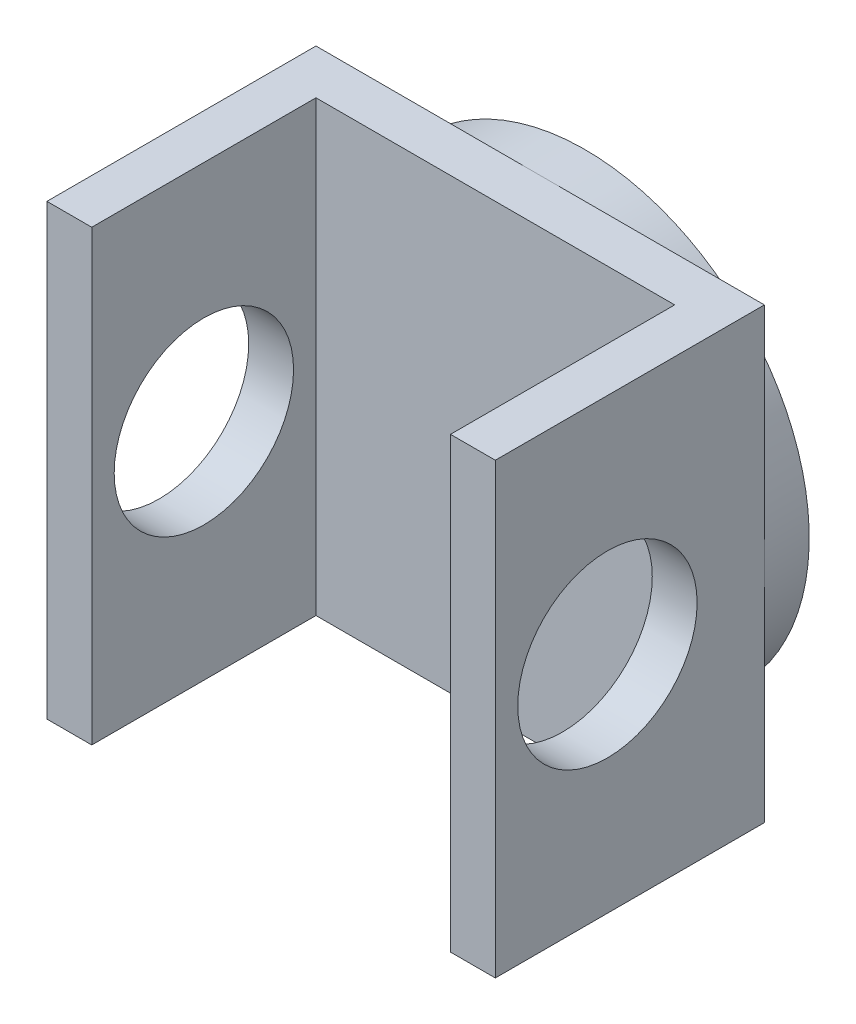
ISO-10303-21;
HEADER;
FILE_DESCRIPTION(('STEP AP214'),'2;1');
FILE_NAME('part.step','',(''),(''),'','','');
FILE_SCHEMA(('AUTOMOTIVE_DESIGN { 1 0 10303 214 1 1 1 1 }'));
ENDSEC;
DATA;
#1=APPLICATION_CONTEXT('core data for automotive mechanical design processes');
#2=APPLICATION_PROTOCOL_DEFINITION('international standard','automotive_design',2000,#1);
#3=PRODUCT_CONTEXT('',#1,'mechanical');
#4=PRODUCT('Part','Part','',(#3));
#5=PRODUCT_RELATED_PRODUCT_CATEGORY('part','',(#4));
#6=PRODUCT_DEFINITION_FORMATION('','',#4);
#7=PRODUCT_DEFINITION_CONTEXT('part definition',#1,'design');
#8=PRODUCT_DEFINITION('design','',#6,#7);
#9=PRODUCT_DEFINITION_SHAPE('','',#8);
#10=(LENGTH_UNIT() NAMED_UNIT(*) SI_UNIT(.MILLI.,.METRE.));
#11=(NAMED_UNIT(*) PLANE_ANGLE_UNIT() SI_UNIT($,.RADIAN.));
#12=(NAMED_UNIT(*) SI_UNIT($,.STERADIAN.) SOLID_ANGLE_UNIT());
#13=UNCERTAINTY_MEASURE_WITH_UNIT(LENGTH_MEASURE(1.E-05),#10,'distance_accuracy_value','');
#14=(GEOMETRIC_REPRESENTATION_CONTEXT(3) GLOBAL_UNCERTAINTY_ASSIGNED_CONTEXT((#13)) GLOBAL_UNIT_ASSIGNED_CONTEXT((#10,
#11,#12)) REPRESENTATION_CONTEXT('',''));
#15=CARTESIAN_POINT('',(0.,0.,0.));
#16=DIRECTION('',(0.,0.,1.));
#17=DIRECTION('',(1.,0.,0.));
#18=AXIS2_PLACEMENT_3D('',#15,#16,#17);
#19=CARTESIAN_POINT('',(0.,0.,0.));
#20=DIRECTION('',(0.,0.,1.));
#21=DIRECTION('',(1.,0.,0.));
#22=AXIS2_PLACEMENT_3D('',#19,#20,#21);
#23=PLANE('',#22);
#24=CARTESIAN_POINT('',(0.,0.,0.));
#25=DIRECTION('',(0.,0.,-1.));
#26=DIRECTION('',(-1.,0.,0.));
#27=AXIS2_PLACEMENT_3D('',#24,#25,#26);
#28=CIRCLE('',#27,5.);
#29=CARTESIAN_POINT('',(-5.,0.,0.));
#30=VERTEX_POINT('',#29);
#31=CARTESIAN_POINT('',(0.,5.,0.));
#32=VERTEX_POINT('',#31);
#33=EDGE_CURVE('E43',#30,#32,#28,.T.);
#34=ORIENTED_EDGE('',*,*,#33,.F.);
#35=DIRECTION('',(0.,-1.,0.));
#36=VECTOR('',#35,1.);
#37=CARTESIAN_POINT('',(-5.,-5.,0.));
#38=LINE('',#37,#36);
#39=CARTESIAN_POINT('',(-5.,5.,0.));
#40=VERTEX_POINT('',#39);
#41=EDGE_CURVE('E114',#40,#30,#38,.T.);
#42=ORIENTED_EDGE('',*,*,#41,.F.);
#43=DIRECTION('',(-1.,0.,0.));
#44=VECTOR('',#43,1.);
#45=CARTESIAN_POINT('',(5.,5.,0.));
#46=LINE('',#45,#44);
#47=EDGE_CURVE('E129',#32,#40,#46,.T.);
#48=ORIENTED_EDGE('',*,*,#47,.F.);
#49=EDGE_LOOP('',(#34,#42,#48));
#50=FACE_BOUND('',#49,.T.);
#51=ADVANCED_FACE('F32',(#50),#23,.F.);
#52=CARTESIAN_POINT('',(5.,0.,0.));
#53=VERTEX_POINT('',#52);
#54=EDGE_CURVE('E11',#32,#53,#28,.T.);
#55=ORIENTED_EDGE('',*,*,#54,.F.);
#56=CARTESIAN_POINT('',(5.,5.,0.));
#57=VERTEX_POINT('',#56);
#58=EDGE_CURVE('E190',#57,#32,#46,.T.);
#59=ORIENTED_EDGE('',*,*,#58,.F.);
#60=DIRECTION('',(0.,1.,0.));
#61=VECTOR('',#60,1.);
#62=CARTESIAN_POINT('',(5.,-5.,0.));
#63=LINE('',#62,#61);
#64=EDGE_CURVE('E193',#53,#57,#63,.T.);
#65=ORIENTED_EDGE('',*,*,#64,.F.);
#66=EDGE_LOOP('',(#55,#59,#65));
#67=FACE_BOUND('',#66,.T.);
#68=ADVANCED_FACE('F221',(#67),#23,.F.);
#69=CARTESIAN_POINT('',(0.,-5.,0.));
#70=VERTEX_POINT('',#69);
#71=EDGE_CURVE('E41',#53,#70,#28,.T.);
#72=ORIENTED_EDGE('',*,*,#71,.F.);
#73=CARTESIAN_POINT('',(5.,-5.,0.));
#74=VERTEX_POINT('',#73);
#75=EDGE_CURVE('E194',#74,#53,#63,.T.);
#76=ORIENTED_EDGE('',*,*,#75,.F.);
#77=DIRECTION('',(1.,0.,0.));
#78=VECTOR('',#77,1.);
#79=CARTESIAN_POINT('',(5.,-5.,0.));
#80=LINE('',#79,#78);
#81=EDGE_CURVE('E121',#70,#74,#80,.T.);
#82=ORIENTED_EDGE('',*,*,#81,.F.);
#83=EDGE_LOOP('',(#72,#76,#82));
#84=FACE_BOUND('',#83,.T.);
#85=ADVANCED_FACE('F207',(#84),#23,.F.);
#86=CARTESIAN_POINT('',(0.,0.,1.));
#87=DIRECTION('',(0.,0.,1.));
#88=DIRECTION('',(1.,0.,0.));
#89=AXIS2_PLACEMENT_3D('',#86,#87,#88);
#90=PLANE('',#89);
#91=DIRECTION('',(1.,0.,0.));
#92=VECTOR('',#91,1.);
#93=CARTESIAN_POINT('',(5.,-5.,1.));
#94=LINE('',#93,#92);
#95=CARTESIAN_POINT('',(-4.,-5.,1.));
#96=VERTEX_POINT('',#95);
#97=CARTESIAN_POINT('',(4.,-5.,1.));
#98=VERTEX_POINT('',#97);
#99=EDGE_CURVE('E187',#96,#98,#94,.T.);
#100=ORIENTED_EDGE('',*,*,#99,.T.);
#101=DIRECTION('',(0.,-1.,0.));
#102=VECTOR('',#101,1.);
#103=CARTESIAN_POINT('',(4.,-5.,1.));
#104=LINE('',#103,#102);
#105=CARTESIAN_POINT('',(4.,5.,1.));
#106=VERTEX_POINT('',#105);
#107=EDGE_CURVE('E149',#106,#98,#104,.T.);
#108=ORIENTED_EDGE('',*,*,#107,.F.);
#109=DIRECTION('',(-1.,0.,0.));
#110=VECTOR('',#109,1.);
#111=CARTESIAN_POINT('',(5.,5.,1.));
#112=LINE('',#111,#110);
#113=CARTESIAN_POINT('',(-4.,5.,1.));
#114=VERTEX_POINT('',#113);
#115=EDGE_CURVE('E189',#106,#114,#112,.T.);
#116=ORIENTED_EDGE('',*,*,#115,.T.);
#117=DIRECTION('',(0.,1.,0.));
#118=VECTOR('',#117,1.);
#119=CARTESIAN_POINT('',(-4.,-5.,1.));
#120=LINE('',#119,#118);
#121=EDGE_CURVE('E169',#96,#114,#120,.T.);
#122=ORIENTED_EDGE('',*,*,#121,.F.);
#123=EDGE_LOOP('',(#100,#108,#116,#122));
#124=FACE_BOUND('',#123,.T.);
#125=ADVANCED_FACE('F234',(#124),#90,.T.);
#126=CARTESIAN_POINT('',(-5.,-5.,1.));
#127=DIRECTION('',(1.,0.,0.));
#128=DIRECTION('',(0.,0.,-1.));
#129=AXIS2_PLACEMENT_3D('',#126,#127,#128);
#130=PLANE('',#129);
#131=CARTESIAN_POINT('',(-5.,0.,3.5));
#132=DIRECTION('',(1.,0.,0.));
#133=DIRECTION('',(0.,0.,-1.));
#134=AXIS2_PLACEMENT_3D('',#131,#132,#133);
#135=CIRCLE('',#134,2.);
#136=CARTESIAN_POINT('',(-5.,0.,1.5));
#137=VERTEX_POINT('',#136);
#138=EDGE_CURVE('E146',#137,#137,#135,.T.);
#139=ORIENTED_EDGE('',*,*,#138,.T.);
#140=EDGE_LOOP('',(#139));
#141=FACE_BOUND('',#140,.T.);
#142=ORIENTED_EDGE('',*,*,#41,.T.);
#143=CARTESIAN_POINT('',(-5.,-5.,0.));
#144=VERTEX_POINT('',#143);
#145=EDGE_CURVE('E115',#30,#144,#38,.T.);
#146=ORIENTED_EDGE('',*,*,#145,.T.);
#147=DIRECTION('',(0.,0.,-1.));
#148=VECTOR('',#147,1.);
#149=CARTESIAN_POINT('',(-5.,-5.,1.));
#150=LINE('',#149,#148);
#151=CARTESIAN_POINT('',(-5.,-5.,6.));
#152=VERTEX_POINT('',#151);
#153=EDGE_CURVE('E135',#152,#144,#150,.T.);
#154=ORIENTED_EDGE('',*,*,#153,.F.);
#155=DIRECTION('',(0.,-1.,0.));
#156=VECTOR('',#155,1.);
#157=CARTESIAN_POINT('',(-5.,-5.,6.));
#158=LINE('',#157,#156);
#159=CARTESIAN_POINT('',(-5.,5.,6.));
#160=VERTEX_POINT('',#159);
#161=EDGE_CURVE('E170',#160,#152,#158,.T.);
#162=ORIENTED_EDGE('',*,*,#161,.F.);
#163=DIRECTION('',(0.,0.,-1.));
#164=VECTOR('',#163,1.);
#165=CARTESIAN_POINT('',(-5.,5.,1.));
#166=LINE('',#165,#164);
#167=EDGE_CURVE('E117',#160,#40,#166,.T.);
#168=ORIENTED_EDGE('',*,*,#167,.T.);
#169=EDGE_LOOP('',(#142,#146,#154,#162,#168));
#170=FACE_BOUND('',#169,.T.);
#171=ADVANCED_FACE('F34',(#141,#170),#130,.F.);
#172=CARTESIAN_POINT('',(5.,-5.,1.));
#173=DIRECTION('',(0.,1.,0.));
#174=DIRECTION('',(-1.,0.,0.));
#175=AXIS2_PLACEMENT_3D('',#172,#173,#174);
#176=PLANE('',#175);
#177=EDGE_CURVE('E125',#144,#70,#80,.T.);
#178=ORIENTED_EDGE('',*,*,#177,.T.);
#179=ORIENTED_EDGE('',*,*,#81,.T.);
#180=DIRECTION('',(0.,0.,-1.));
#181=VECTOR('',#180,1.);
#182=CARTESIAN_POINT('',(5.,-5.,1.));
#183=LINE('',#182,#181);
#184=CARTESIAN_POINT('',(5.,-5.,6.));
#185=VERTEX_POINT('',#184);
#186=EDGE_CURVE('E136',#185,#74,#183,.T.);
#187=ORIENTED_EDGE('',*,*,#186,.F.);
#188=DIRECTION('',(1.,0.,0.));
#189=VECTOR('',#188,1.);
#190=CARTESIAN_POINT('',(4.,-5.,6.));
#191=LINE('',#190,#189);
#192=CARTESIAN_POINT('',(4.,-5.,6.));
#193=VERTEX_POINT('',#192);
#194=EDGE_CURVE('E153',#193,#185,#191,.T.);
#195=ORIENTED_EDGE('',*,*,#194,.F.);
#196=DIRECTION('',(0.,0.,-1.));
#197=VECTOR('',#196,1.);
#198=CARTESIAN_POINT('',(4.,-5.,6.));
#199=LINE('',#198,#197);
#200=EDGE_CURVE('E166',#193,#98,#199,.T.);
#201=ORIENTED_EDGE('',*,*,#200,.T.);
#202=ORIENTED_EDGE('',*,*,#99,.F.);
#203=DIRECTION('',(0.,0.,-1.));
#204=VECTOR('',#203,1.);
#205=CARTESIAN_POINT('',(-4.,-5.,6.));
#206=LINE('',#205,#204);
#207=CARTESIAN_POINT('',(-4.,-5.,6.));
#208=VERTEX_POINT('',#207);
#209=EDGE_CURVE('E127',#208,#96,#206,.T.);
#210=ORIENTED_EDGE('',*,*,#209,.F.);
#211=DIRECTION('',(1.,0.,0.));
#212=VECTOR('',#211,1.);
#213=CARTESIAN_POINT('',(-4.,-5.,6.));
#214=LINE('',#213,#212);
#215=EDGE_CURVE('E173',#152,#208,#214,.T.);
#216=ORIENTED_EDGE('',*,*,#215,.F.);
#217=ORIENTED_EDGE('',*,*,#153,.T.);
#218=EDGE_LOOP('',(#178,#179,#187,#195,#201,#202,#210,#216,#217));
#219=FACE_BOUND('',#218,.T.);
#220=ADVANCED_FACE('F208',(#219),#176,.F.);
#221=CARTESIAN_POINT('',(5.,-5.,1.));
#222=DIRECTION('',(-1.,0.,0.));
#223=DIRECTION('',(0.,0.,1.));
#224=AXIS2_PLACEMENT_3D('',#221,#222,#223);
#225=PLANE('',#224);
#226=CARTESIAN_POINT('',(5.,0.,3.5));
#227=DIRECTION('',(1.,0.,0.));
#228=DIRECTION('',(0.,0.,-1.));
#229=AXIS2_PLACEMENT_3D('',#226,#227,#228);
#230=CIRCLE('',#229,2.);
#231=CARTESIAN_POINT('',(5.,0.,1.5));
#232=VERTEX_POINT('',#231);
#233=EDGE_CURVE('E140',#232,#232,#230,.T.);
#234=ORIENTED_EDGE('',*,*,#233,.F.);
#235=EDGE_LOOP('',(#234));
#236=FACE_BOUND('',#235,.T.);
#237=ORIENTED_EDGE('',*,*,#75,.T.);
#238=ORIENTED_EDGE('',*,*,#64,.T.);
#239=DIRECTION('',(0.,0.,-1.));
#240=VECTOR('',#239,1.);
#241=CARTESIAN_POINT('',(5.,5.,1.));
#242=LINE('',#241,#240);
#243=CARTESIAN_POINT('',(5.,5.,6.));
#244=VERTEX_POINT('',#243);
#245=EDGE_CURVE('E199',#244,#57,#242,.T.);
#246=ORIENTED_EDGE('',*,*,#245,.F.);
#247=DIRECTION('',(0.,1.,0.));
#248=VECTOR('',#247,1.);
#249=CARTESIAN_POINT('',(5.,-5.,6.));
#250=LINE('',#249,#248);
#251=EDGE_CURVE('E156',#185,#244,#250,.T.);
#252=ORIENTED_EDGE('',*,*,#251,.F.);
#253=ORIENTED_EDGE('',*,*,#186,.T.);
#254=EDGE_LOOP('',(#237,#238,#246,#252,#253));
#255=FACE_BOUND('',#254,.T.);
#256=ADVANCED_FACE('F205',(#236,#255),#225,.F.);
#257=CARTESIAN_POINT('',(5.,5.,1.));
#258=DIRECTION('',(0.,-1.,0.));
#259=DIRECTION('',(1.,0.,0.));
#260=AXIS2_PLACEMENT_3D('',#257,#258,#259);
#261=PLANE('',#260);
#262=ORIENTED_EDGE('',*,*,#58,.T.);
#263=ORIENTED_EDGE('',*,*,#47,.T.);
#264=ORIENTED_EDGE('',*,*,#167,.F.);
#265=DIRECTION('',(-1.,0.,0.));
#266=VECTOR('',#265,1.);
#267=CARTESIAN_POINT('',(-4.,5.,6.));
#268=LINE('',#267,#266);
#269=CARTESIAN_POINT('',(-4.,5.,6.));
#270=VERTEX_POINT('',#269);
#271=EDGE_CURVE('E177',#270,#160,#268,.T.);
#272=ORIENTED_EDGE('',*,*,#271,.F.);
#273=DIRECTION('',(0.,0.,-1.));
#274=VECTOR('',#273,1.);
#275=CARTESIAN_POINT('',(-4.,5.,6.));
#276=LINE('',#275,#274);
#277=EDGE_CURVE('E180',#270,#114,#276,.T.);
#278=ORIENTED_EDGE('',*,*,#277,.T.);
#279=ORIENTED_EDGE('',*,*,#115,.F.);
#280=DIRECTION('',(0.,0.,-1.));
#281=VECTOR('',#280,1.);
#282=CARTESIAN_POINT('',(4.,5.,6.));
#283=LINE('',#282,#281);
#284=CARTESIAN_POINT('',(4.,5.,6.));
#285=VERTEX_POINT('',#284);
#286=EDGE_CURVE('E161',#285,#106,#283,.T.);
#287=ORIENTED_EDGE('',*,*,#286,.F.);
#288=DIRECTION('',(-1.,0.,0.));
#289=VECTOR('',#288,1.);
#290=CARTESIAN_POINT('',(4.,5.,6.));
#291=LINE('',#290,#289);
#292=EDGE_CURVE('E159',#244,#285,#291,.T.);
#293=ORIENTED_EDGE('',*,*,#292,.F.);
#294=ORIENTED_EDGE('',*,*,#245,.T.);
#295=EDGE_LOOP('',(#262,#263,#264,#272,#278,#279,#287,#293,#294));
#296=FACE_BOUND('',#295,.T.);
#297=ADVANCED_FACE('F217',(#296),#261,.F.);
#298=EDGE_CURVE('E50',#70,#30,#28,.T.);
#299=ORIENTED_EDGE('',*,*,#298,.F.);
#300=ORIENTED_EDGE('',*,*,#177,.F.);
#301=ORIENTED_EDGE('',*,*,#145,.F.);
#302=EDGE_LOOP('',(#299,#300,#301));
#303=FACE_BOUND('',#302,.T.);
#304=ADVANCED_FACE('F123',(#303),#23,.F.);
#305=CARTESIAN_POINT('',(-4.,-5.,6.));
#306=DIRECTION('',(-1.,0.,0.));
#307=DIRECTION('',(0.,0.,1.));
#308=AXIS2_PLACEMENT_3D('',#305,#306,#307);
#309=PLANE('',#308);
#310=CARTESIAN_POINT('',(-4.,0.,3.5));
#311=DIRECTION('',(-1.,0.,0.));
#312=DIRECTION('',(0.,0.,1.));
#313=AXIS2_PLACEMENT_3D('',#310,#311,#312);
#314=CIRCLE('',#313,2.);
#315=CARTESIAN_POINT('',(-4.,0.,5.5));
#316=VERTEX_POINT('',#315);
#317=EDGE_CURVE('E143',#316,#316,#314,.T.);
#318=ORIENTED_EDGE('',*,*,#317,.T.);
#319=EDGE_LOOP('',(#318));
#320=FACE_BOUND('',#319,.T.);
#321=ORIENTED_EDGE('',*,*,#121,.T.);
#322=ORIENTED_EDGE('',*,*,#277,.F.);
#323=DIRECTION('',(0.,1.,0.));
#324=VECTOR('',#323,1.);
#325=CARTESIAN_POINT('',(-4.,-5.,6.));
#326=LINE('',#325,#324);
#327=EDGE_CURVE('E175',#208,#270,#326,.T.);
#328=ORIENTED_EDGE('',*,*,#327,.F.);
#329=ORIENTED_EDGE('',*,*,#209,.T.);
#330=EDGE_LOOP('',(#321,#322,#328,#329));
#331=FACE_BOUND('',#330,.T.);
#332=ADVANCED_FACE('F233',(#320,#331),#309,.F.);
#333=CARTESIAN_POINT('',(0.,0.,6.));
#334=DIRECTION('',(0.,0.,1.));
#335=DIRECTION('',(1.,0.,0.));
#336=AXIS2_PLACEMENT_3D('',#333,#334,#335);
#337=PLANE('',#336);
#338=ORIENTED_EDGE('',*,*,#161,.T.);
#339=ORIENTED_EDGE('',*,*,#215,.T.);
#340=ORIENTED_EDGE('',*,*,#327,.T.);
#341=ORIENTED_EDGE('',*,*,#271,.T.);
#342=EDGE_LOOP('',(#338,#339,#340,#341));
#343=FACE_BOUND('',#342,.T.);
#344=ADVANCED_FACE('F212',(#343),#337,.T.);
#345=CARTESIAN_POINT('',(4.,-5.,6.));
#346=DIRECTION('',(1.,0.,0.));
#347=DIRECTION('',(0.,0.,-1.));
#348=AXIS2_PLACEMENT_3D('',#345,#346,#347);
#349=PLANE('',#348);
#350=CARTESIAN_POINT('',(4.,0.,3.5));
#351=DIRECTION('',(1.,0.,0.));
#352=DIRECTION('',(0.,0.,-1.));
#353=AXIS2_PLACEMENT_3D('',#350,#351,#352);
#354=CIRCLE('',#353,2.);
#355=CARTESIAN_POINT('',(4.,0.,1.5));
#356=VERTEX_POINT('',#355);
#357=EDGE_CURVE('E36',#356,#356,#354,.T.);
#358=ORIENTED_EDGE('',*,*,#357,.T.);
#359=EDGE_LOOP('',(#358));
#360=FACE_BOUND('',#359,.T.);
#361=ORIENTED_EDGE('',*,*,#107,.T.);
#362=ORIENTED_EDGE('',*,*,#200,.F.);
#363=DIRECTION('',(0.,-1.,0.));
#364=VECTOR('',#363,1.);
#365=CARTESIAN_POINT('',(4.,-5.,6.));
#366=LINE('',#365,#364);
#367=EDGE_CURVE('E150',#285,#193,#366,.T.);
#368=ORIENTED_EDGE('',*,*,#367,.F.);
#369=ORIENTED_EDGE('',*,*,#286,.T.);
#370=EDGE_LOOP('',(#361,#362,#368,#369));
#371=FACE_BOUND('',#370,.T.);
#372=ADVANCED_FACE('F229',(#360,#371),#349,.F.);
#373=CARTESIAN_POINT('',(0.,0.,6.));
#374=DIRECTION('',(0.,0.,-1.));
#375=DIRECTION('',(-1.,0.,0.));
#376=AXIS2_PLACEMENT_3D('',#373,#374,#375);
#377=PLANE('',#376);
#378=ORIENTED_EDGE('',*,*,#367,.T.);
#379=ORIENTED_EDGE('',*,*,#194,.T.);
#380=ORIENTED_EDGE('',*,*,#251,.T.);
#381=ORIENTED_EDGE('',*,*,#292,.T.);
#382=EDGE_LOOP('',(#378,#379,#380,#381));
#383=FACE_BOUND('',#382,.T.);
#384=ADVANCED_FACE('F223',(#383),#377,.F.);
#385=CARTESIAN_POINT('',(-7.,0.,3.5));
#386=DIRECTION('',(1.,0.,0.));
#387=DIRECTION('',(0.,0.,-1.));
#388=AXIS2_PLACEMENT_3D('',#385,#386,#387);
#389=CYLINDRICAL_SURFACE('',#388,2.);
#390=ORIENTED_EDGE('',*,*,#233,.T.);
#391=EDGE_LOOP('',(#390));
#392=FACE_BOUND('',#391,.T.);
#393=ORIENTED_EDGE('',*,*,#357,.F.);
#394=EDGE_LOOP('',(#393));
#395=FACE_BOUND('',#394,.T.);
#396=ADVANCED_FACE('F283',(#392,#395),#389,.F.);
#397=ORIENTED_EDGE('',*,*,#317,.F.);
#398=EDGE_LOOP('',(#397));
#399=FACE_BOUND('',#398,.T.);
#400=ORIENTED_EDGE('',*,*,#138,.F.);
#401=EDGE_LOOP('',(#400));
#402=FACE_BOUND('',#401,.T.);
#403=ADVANCED_FACE('F274',(#399,#402),#389,.F.);
#404=CARTESIAN_POINT('',(0.,0.,-1.));
#405=DIRECTION('',(0.,0.,-1.));
#406=DIRECTION('',(-1.,0.,0.));
#407=AXIS2_PLACEMENT_3D('',#404,#405,#406);
#408=PLANE('',#407);
#409=CARTESIAN_POINT('',(0.,0.,-1.));
#410=DIRECTION('',(0.,0.,-1.));
#411=DIRECTION('',(-1.,0.,0.));
#412=AXIS2_PLACEMENT_3D('',#409,#410,#411);
#413=CIRCLE('',#412,5.);
#414=CARTESIAN_POINT('',(-5.,0.,-1.));
#415=VERTEX_POINT('',#414);
#416=EDGE_CURVE('E132',#415,#415,#413,.T.);
#417=ORIENTED_EDGE('',*,*,#416,.T.);
#418=EDGE_LOOP('',(#417));
#419=FACE_BOUND('',#418,.T.);
#420=CARTESIAN_POINT('',(0.,0.,-1.));
#421=DIRECTION('',(0.,0.,-1.));
#422=DIRECTION('',(-1.,0.,0.));
#423=AXIS2_PLACEMENT_3D('',#420,#421,#422);
#424=CIRCLE('',#423,4.);
#425=CARTESIAN_POINT('',(-4.,0.,-1.));
#426=VERTEX_POINT('',#425);
#427=EDGE_CURVE('E133',#426,#426,#424,.T.);
#428=ORIENTED_EDGE('',*,*,#427,.F.);
#429=EDGE_LOOP('',(#428));
#430=FACE_BOUND('',#429,.T.);
#431=ADVANCED_FACE('F272',(#419,#430),#408,.T.);
#432=CARTESIAN_POINT('',(0.,0.,-1.));
#433=DIRECTION('',(0.,0.,1.));
#434=DIRECTION('',(1.,0.,0.));
#435=AXIS2_PLACEMENT_3D('',#432,#433,#434);
#436=CYLINDRICAL_SURFACE('',#435,5.);
#437=ORIENTED_EDGE('',*,*,#416,.F.);
#438=EDGE_LOOP('',(#437));
#439=FACE_BOUND('',#438,.T.);
#440=ORIENTED_EDGE('',*,*,#33,.T.);
#441=ORIENTED_EDGE('',*,*,#54,.T.);
#442=ORIENTED_EDGE('',*,*,#71,.T.);
#443=ORIENTED_EDGE('',*,*,#298,.T.);
#444=EDGE_LOOP('',(#440,#441,#442,#443));
#445=FACE_BOUND('',#444,.T.);
#446=ADVANCED_FACE('F134',(#439,#445),#436,.T.);
#447=CARTESIAN_POINT('',(0.,0.,-1.));
#448=DIRECTION('',(0.,0.,1.));
#449=DIRECTION('',(1.,0.,0.));
#450=AXIS2_PLACEMENT_3D('',#447,#448,#449);
#451=CYLINDRICAL_SURFACE('',#450,4.);
#452=ORIENTED_EDGE('',*,*,#427,.T.);
#453=EDGE_LOOP('',(#452));
#454=FACE_BOUND('',#453,.T.);
#455=CARTESIAN_POINT('',(0.,0.,0.));
#456=DIRECTION('',(0.,0.,-1.));
#457=DIRECTION('',(-1.,0.,0.));
#458=AXIS2_PLACEMENT_3D('',#455,#456,#457);
#459=CIRCLE('',#458,4.);
#460=CARTESIAN_POINT('',(-4.,0.,0.));
#461=VERTEX_POINT('',#460);
#462=EDGE_CURVE('E266',#461,#461,#459,.T.);
#463=ORIENTED_EDGE('',*,*,#462,.F.);
#464=EDGE_LOOP('',(#463));
#465=FACE_BOUND('',#464,.T.);
#466=ADVANCED_FACE('F257',(#454,#465),#451,.F.);
#467=ORIENTED_EDGE('',*,*,#462,.T.);
#468=EDGE_LOOP('',(#467));
#469=FACE_BOUND('',#468,.T.);
#470=ADVANCED_FACE('F243',(#469),#23,.F.);
#471=CLOSED_SHELL('',(#51,#68,#85,#125,#171,#220,#256,#297,#304,#332,#344,#372,#384,#396,#403,
#431,#446,#466,#470));
#472=MANIFOLD_SOLID_BREP('B2',#471);
#473=ADVANCED_BREP_SHAPE_REPRESENTATION('',(#18,#472),#14);
#474=SHAPE_DEFINITION_REPRESENTATION(#9,#473);
ENDSEC;
END-ISO-10303-21;
